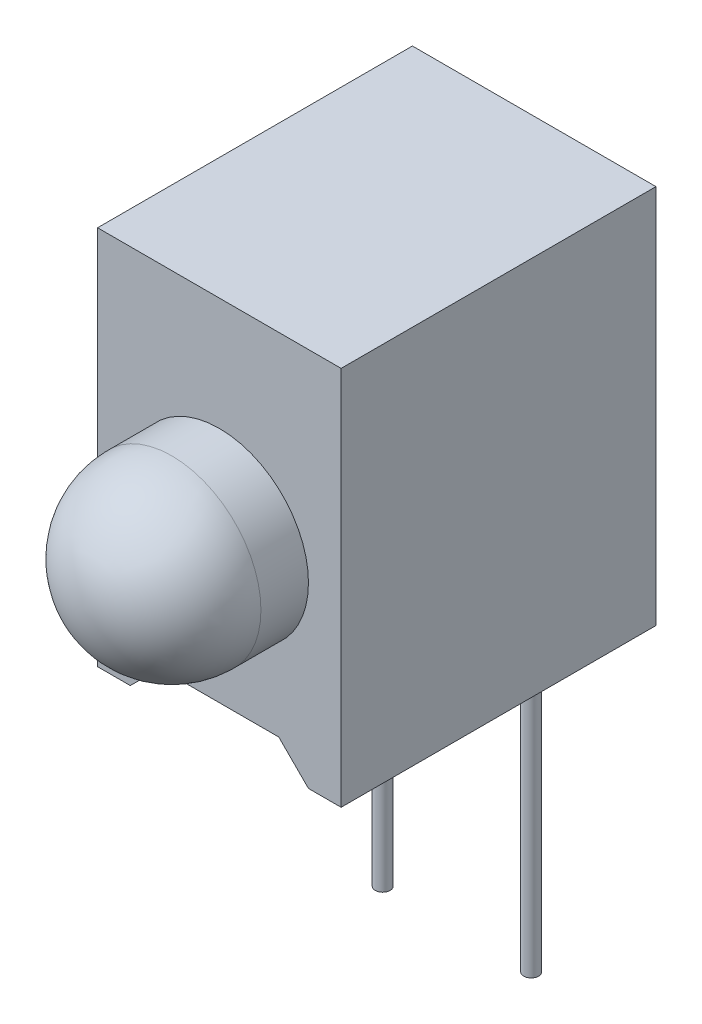
ISO-10303-21;
HEADER;
FILE_DESCRIPTION(('STEP AP214'),'2;1');
FILE_NAME('part.step','',(''),(''),'','','');
FILE_SCHEMA(('AUTOMOTIVE_DESIGN { 1 0 10303 214 1 1 1 1 }'));
ENDSEC;
DATA;
#1=APPLICATION_CONTEXT('core data for automotive mechanical design processes');
#2=APPLICATION_PROTOCOL_DEFINITION('international standard','automotive_design',2000,#1);
#3=PRODUCT_CONTEXT('',#1,'mechanical');
#4=PRODUCT('Part','Part','',(#3));
#5=PRODUCT_RELATED_PRODUCT_CATEGORY('part','',(#4));
#6=PRODUCT_DEFINITION_FORMATION('','',#4);
#7=PRODUCT_DEFINITION_CONTEXT('part definition',#1,'design');
#8=PRODUCT_DEFINITION('design','',#6,#7);
#9=PRODUCT_DEFINITION_SHAPE('','',#8);
#10=(LENGTH_UNIT() NAMED_UNIT(*) SI_UNIT(.MILLI.,.METRE.));
#11=(NAMED_UNIT(*) PLANE_ANGLE_UNIT() SI_UNIT($,.RADIAN.));
#12=(NAMED_UNIT(*) SI_UNIT($,.STERADIAN.) SOLID_ANGLE_UNIT());
#13=UNCERTAINTY_MEASURE_WITH_UNIT(LENGTH_MEASURE(1.E-05),#10,'distance_accuracy_value','');
#14=(GEOMETRIC_REPRESENTATION_CONTEXT(3) GLOBAL_UNCERTAINTY_ASSIGNED_CONTEXT((#13)) GLOBAL_UNIT_ASSIGNED_CONTEXT((#10,
#11,#12)) REPRESENTATION_CONTEXT('',''));
#15=CARTESIAN_POINT('',(0.,0.,0.));
#16=DIRECTION('',(0.,0.,1.));
#17=DIRECTION('',(1.,0.,0.));
#18=AXIS2_PLACEMENT_3D('',#15,#16,#17);
#19=CARTESIAN_POINT('',(-1.5,0.,-5.3));
#20=DIRECTION('',(0.707106781186544,-0.707106781186551,0.));
#21=DIRECTION('',(0.707106781186551,0.707106781186544,0.));
#22=AXIS2_PLACEMENT_3D('',#19,#20,#21);
#23=PLANE('',#22);
#24=DIRECTION('',(0.707106781186551,0.707106781186544,0.));
#25=VECTOR('',#24,1.);
#26=CARTESIAN_POINT('',(-1.5,0.,0.));
#27=LINE('',#26,#25);
#28=CARTESIAN_POINT('',(-1.5,0.,0.));
#29=VERTEX_POINT('',#28);
#30=CARTESIAN_POINT('',(-0.999999999999995,0.5,0.));
#31=VERTEX_POINT('',#30);
#32=EDGE_CURVE('E110',#29,#31,#27,.T.);
#33=ORIENTED_EDGE('',*,*,#32,.F.);
#34=DIRECTION('',(0.,0.,1.));
#35=VECTOR('',#34,1.);
#36=CARTESIAN_POINT('',(-1.5,0.,-5.3));
#37=LINE('',#36,#35);
#38=CARTESIAN_POINT('',(-1.5,0.,-5.3));
#39=VERTEX_POINT('',#38);
#40=EDGE_CURVE('E97',#39,#29,#37,.T.);
#41=ORIENTED_EDGE('',*,*,#40,.F.);
#42=DIRECTION('',(0.707106781186551,0.707106781186544,0.));
#43=VECTOR('',#42,1.);
#44=CARTESIAN_POINT('',(-1.5,0.,-5.3));
#45=LINE('',#44,#43);
#46=CARTESIAN_POINT('',(-0.999999999999995,0.5,-5.3));
#47=VERTEX_POINT('',#46);
#48=EDGE_CURVE('E142',#39,#47,#45,.T.);
#49=ORIENTED_EDGE('',*,*,#48,.T.);
#50=DIRECTION('',(0.,0.,1.));
#51=VECTOR('',#50,1.);
#52=CARTESIAN_POINT('',(-0.999999999999995,0.5,-5.3));
#53=LINE('',#52,#51);
#54=EDGE_CURVE('E106',#47,#31,#53,.T.);
#55=ORIENTED_EDGE('',*,*,#54,.T.);
#56=EDGE_LOOP('',(#33,#41,#49,#55));
#57=FACE_BOUND('',#56,.T.);
#58=CARTESIAN_POINT('',(-1.25,0.249999999999998,-4.));
#59=DIRECTION('',(0.707106781186544,-0.707106781186551,0.));
#60=DIRECTION('',(0.707106781186551,0.707106781186544,0.));
#61=AXIS2_PLACEMENT_3D('',#58,#59,#60);
#62=ELLIPSE('',#61,0.176776695296636,0.125);
#63=CARTESIAN_POINT('',(-1.125,0.374999999999996,-4.));
#64=VERTEX_POINT('',#63);
#65=EDGE_CURVE('E36',#64,#64,#62,.F.);
#66=ORIENTED_EDGE('',*,*,#65,.T.);
#67=EDGE_LOOP('',(#66));
#68=FACE_BOUND('',#67,.T.);
#69=ADVANCED_FACE('F32',(#57,#68),#23,.T.);
#70=CARTESIAN_POINT('',(0.999999999999995,0.5,-5.3));
#71=DIRECTION('',(-0.707106781186543,-0.707106781186551,0.));
#72=DIRECTION('',(0.707106781186552,-0.707106781186544,0.));
#73=AXIS2_PLACEMENT_3D('',#70,#71,#72);
#74=PLANE('',#73);
#75=DIRECTION('',(0.707106781186551,-0.707106781186543,0.));
#76=VECTOR('',#75,1.);
#77=CARTESIAN_POINT('',(0.999999999999995,0.5,0.));
#78=LINE('',#77,#76);
#79=CARTESIAN_POINT('',(0.999999999999995,0.5,0.));
#80=VERTEX_POINT('',#79);
#81=CARTESIAN_POINT('',(1.5,0.,0.));
#82=VERTEX_POINT('',#81);
#83=EDGE_CURVE('E129',#80,#82,#78,.T.);
#84=ORIENTED_EDGE('',*,*,#83,.F.);
#85=DIRECTION('',(0.,0.,1.));
#86=VECTOR('',#85,1.);
#87=CARTESIAN_POINT('',(0.999999999999995,0.5,-5.3));
#88=LINE('',#87,#86);
#89=CARTESIAN_POINT('',(0.999999999999995,0.5,-5.3));
#90=VERTEX_POINT('',#89);
#91=EDGE_CURVE('E167',#90,#80,#88,.T.);
#92=ORIENTED_EDGE('',*,*,#91,.F.);
#93=DIRECTION('',(0.707106781186551,-0.707106781186543,0.));
#94=VECTOR('',#93,1.);
#95=CARTESIAN_POINT('',(0.999999999999995,0.5,-5.3));
#96=LINE('',#95,#94);
#97=CARTESIAN_POINT('',(1.5,0.,-5.3));
#98=VERTEX_POINT('',#97);
#99=EDGE_CURVE('E147',#90,#98,#96,.T.);
#100=ORIENTED_EDGE('',*,*,#99,.T.);
#101=DIRECTION('',(0.,0.,1.));
#102=VECTOR('',#101,1.);
#103=CARTESIAN_POINT('',(1.5,0.,-5.3));
#104=LINE('',#103,#102);
#105=EDGE_CURVE('E165',#98,#82,#104,.T.);
#106=ORIENTED_EDGE('',*,*,#105,.T.);
#107=EDGE_LOOP('',(#84,#92,#100,#106));
#108=FACE_BOUND('',#107,.T.);
#109=CARTESIAN_POINT('',(1.25,0.249999999999997,-4.));
#110=DIRECTION('',(-0.707106781186543,-0.707106781186551,0.));
#111=DIRECTION('',(-0.707106781186552,0.707106781186544,0.));
#112=AXIS2_PLACEMENT_3D('',#109,#110,#111);
#113=ELLIPSE('',#112,0.176776695296636,0.125);
#114=CARTESIAN_POINT('',(1.125,0.374999999999995,-4.));
#115=VERTEX_POINT('',#114);
#116=EDGE_CURVE('E124',#115,#115,#113,.F.);
#117=ORIENTED_EDGE('',*,*,#116,.T.);
#118=EDGE_LOOP('',(#117));
#119=FACE_BOUND('',#118,.T.);
#120=ADVANCED_FACE('F198',(#108,#119),#74,.T.);
#121=CARTESIAN_POINT('',(-2.05,0.,0.));
#122=DIRECTION('',(0.,0.,1.));
#123=DIRECTION('',(1.,0.,0.));
#124=AXIS2_PLACEMENT_3D('',#121,#122,#123);
#125=PLANE('',#124);
#126=DIRECTION('',(1.,0.,0.));
#127=VECTOR('',#126,1.);
#128=CARTESIAN_POINT('',(-1.5,0.,0.));
#129=LINE('',#128,#127);
#130=CARTESIAN_POINT('',(-2.05,0.,0.));
#131=VERTEX_POINT('',#130);
#132=EDGE_CURVE('E100',#131,#29,#129,.T.);
#133=ORIENTED_EDGE('',*,*,#132,.T.);
#134=ORIENTED_EDGE('',*,*,#32,.T.);
#135=DIRECTION('',(1.,0.,0.));
#136=VECTOR('',#135,1.);
#137=CARTESIAN_POINT('',(-0.999999999999995,0.5,0.));
#138=LINE('',#137,#136);
#139=EDGE_CURVE('E115',#31,#80,#138,.T.);
#140=ORIENTED_EDGE('',*,*,#139,.T.);
#141=ORIENTED_EDGE('',*,*,#83,.T.);
#142=DIRECTION('',(1.,0.,0.));
#143=VECTOR('',#142,1.);
#144=CARTESIAN_POINT('',(2.05,0.,0.));
#145=LINE('',#144,#143);
#146=CARTESIAN_POINT('',(2.05,0.,0.));
#147=VERTEX_POINT('',#146);
#148=EDGE_CURVE('E132',#82,#147,#145,.T.);
#149=ORIENTED_EDGE('',*,*,#148,.T.);
#150=DIRECTION('',(0.,1.,0.));
#151=VECTOR('',#150,1.);
#152=CARTESIAN_POINT('',(2.05,6.4,0.));
#153=LINE('',#152,#151);
#154=CARTESIAN_POINT('',(2.05,6.4,0.));
#155=VERTEX_POINT('',#154);
#156=EDGE_CURVE('E135',#147,#155,#153,.T.);
#157=ORIENTED_EDGE('',*,*,#156,.T.);
#158=DIRECTION('',(-1.,0.,0.));
#159=VECTOR('',#158,1.);
#160=CARTESIAN_POINT('',(2.05,6.4,0.));
#161=LINE('',#160,#159);
#162=CARTESIAN_POINT('',(-2.05,6.39999999999999,0.));
#163=VERTEX_POINT('',#162);
#164=EDGE_CURVE('E138',#155,#163,#161,.T.);
#165=ORIENTED_EDGE('',*,*,#164,.T.);
#166=DIRECTION('',(0.,-1.,0.));
#167=VECTOR('',#166,1.);
#168=CARTESIAN_POINT('',(-2.05,6.39999999999999,0.));
#169=LINE('',#168,#167);
#170=EDGE_CURVE('E120',#163,#131,#169,.T.);
#171=ORIENTED_EDGE('',*,*,#170,.T.);
#172=EDGE_LOOP('',(#133,#134,#140,#141,#149,#157,#165,#171));
#173=FACE_BOUND('',#172,.T.);
#174=CARTESIAN_POINT('',(0.,3.,0.));
#175=DIRECTION('',(0.,0.,1.));
#176=DIRECTION('',(1.,0.,0.));
#177=AXIS2_PLACEMENT_3D('',#174,#175,#176);
#178=CIRCLE('',#177,1.5);
#179=CARTESIAN_POINT('',(1.5,3.,0.));
#180=VERTEX_POINT('',#179);
#181=EDGE_CURVE('E121',#180,#180,#178,.T.);
#182=ORIENTED_EDGE('',*,*,#181,.F.);
#183=EDGE_LOOP('',(#182));
#184=FACE_BOUND('',#183,.T.);
#185=ADVANCED_FACE('F117',(#173,#184),#125,.T.);
#186=CARTESIAN_POINT('',(-1.5,0.,-5.3));
#187=DIRECTION('',(0.,-1.,0.));
#188=DIRECTION('',(1.,0.,0.));
#189=AXIS2_PLACEMENT_3D('',#186,#187,#188);
#190=PLANE('',#189);
#191=ORIENTED_EDGE('',*,*,#132,.F.);
#192=DIRECTION('',(0.,0.,1.));
#193=VECTOR('',#192,1.);
#194=CARTESIAN_POINT('',(-2.05,0.,-5.3));
#195=LINE('',#194,#193);
#196=CARTESIAN_POINT('',(-2.05,0.,-5.3));
#197=VERTEX_POINT('',#196);
#198=EDGE_CURVE('E41',#197,#131,#195,.T.);
#199=ORIENTED_EDGE('',*,*,#198,.F.);
#200=DIRECTION('',(1.,0.,0.));
#201=VECTOR('',#200,1.);
#202=CARTESIAN_POINT('',(-1.5,0.,-5.3));
#203=LINE('',#202,#201);
#204=EDGE_CURVE('E102',#197,#39,#203,.T.);
#205=ORIENTED_EDGE('',*,*,#204,.T.);
#206=ORIENTED_EDGE('',*,*,#40,.T.);
#207=EDGE_LOOP('',(#191,#199,#205,#206));
#208=FACE_BOUND('',#207,.T.);
#209=ADVANCED_FACE('F34',(#208),#190,.T.);
#210=CARTESIAN_POINT('',(-2.05,6.39999999999999,-5.3));
#211=DIRECTION('',(-1.,0.,0.));
#212=DIRECTION('',(0.,-1.,0.));
#213=AXIS2_PLACEMENT_3D('',#210,#211,#212);
#214=PLANE('',#213);
#215=ORIENTED_EDGE('',*,*,#170,.F.);
#216=DIRECTION('',(0.,0.,1.));
#217=VECTOR('',#216,1.);
#218=CARTESIAN_POINT('',(-2.05,6.39999999999999,-5.3));
#219=LINE('',#218,#217);
#220=CARTESIAN_POINT('',(-2.05,6.39999999999999,-5.3));
#221=VERTEX_POINT('',#220);
#222=EDGE_CURVE('E56',#221,#163,#219,.T.);
#223=ORIENTED_EDGE('',*,*,#222,.F.);
#224=DIRECTION('',(0.,-1.,0.));
#225=VECTOR('',#224,1.);
#226=CARTESIAN_POINT('',(-2.05,6.39999999999999,-5.3));
#227=LINE('',#226,#225);
#228=EDGE_CURVE('E107',#221,#197,#227,.T.);
#229=ORIENTED_EDGE('',*,*,#228,.T.);
#230=ORIENTED_EDGE('',*,*,#198,.T.);
#231=EDGE_LOOP('',(#215,#223,#229,#230));
#232=FACE_BOUND('',#231,.T.);
#233=ADVANCED_FACE('F221',(#232),#214,.T.);
#234=CARTESIAN_POINT('',(2.05,6.4,-5.3));
#235=DIRECTION('',(0.,1.,0.));
#236=DIRECTION('',(-1.,0.,0.));
#237=AXIS2_PLACEMENT_3D('',#234,#235,#236);
#238=PLANE('',#237);
#239=ORIENTED_EDGE('',*,*,#164,.F.);
#240=DIRECTION('',(0.,0.,1.));
#241=VECTOR('',#240,1.);
#242=CARTESIAN_POINT('',(2.05,6.4,-5.3));
#243=LINE('',#242,#241);
#244=CARTESIAN_POINT('',(2.05,6.4,-5.3));
#245=VERTEX_POINT('',#244);
#246=EDGE_CURVE('E161',#245,#155,#243,.T.);
#247=ORIENTED_EDGE('',*,*,#246,.F.);
#248=DIRECTION('',(-1.,0.,0.));
#249=VECTOR('',#248,1.);
#250=CARTESIAN_POINT('',(2.05,6.4,-5.3));
#251=LINE('',#250,#249);
#252=EDGE_CURVE('E156',#245,#221,#251,.T.);
#253=ORIENTED_EDGE('',*,*,#252,.T.);
#254=ORIENTED_EDGE('',*,*,#222,.T.);
#255=EDGE_LOOP('',(#239,#247,#253,#254));
#256=FACE_BOUND('',#255,.T.);
#257=ADVANCED_FACE('F217',(#256),#238,.T.);
#258=CARTESIAN_POINT('',(2.05,6.4,-5.3));
#259=DIRECTION('',(1.,0.,0.));
#260=DIRECTION('',(0.,0.,-1.));
#261=AXIS2_PLACEMENT_3D('',#258,#259,#260);
#262=PLANE('',#261);
#263=ORIENTED_EDGE('',*,*,#156,.F.);
#264=DIRECTION('',(0.,0.,1.));
#265=VECTOR('',#264,1.);
#266=CARTESIAN_POINT('',(2.05,0.,-5.3));
#267=LINE('',#266,#265);
#268=CARTESIAN_POINT('',(2.05,0.,-5.3));
#269=VERTEX_POINT('',#268);
#270=EDGE_CURVE('E163',#269,#147,#267,.T.);
#271=ORIENTED_EDGE('',*,*,#270,.F.);
#272=DIRECTION('',(0.,1.,0.));
#273=VECTOR('',#272,1.);
#274=CARTESIAN_POINT('',(2.05,6.4,-5.3));
#275=LINE('',#274,#273);
#276=EDGE_CURVE('E153',#269,#245,#275,.T.);
#277=ORIENTED_EDGE('',*,*,#276,.T.);
#278=ORIENTED_EDGE('',*,*,#246,.T.);
#279=EDGE_LOOP('',(#263,#271,#277,#278));
#280=FACE_BOUND('',#279,.T.);
#281=ADVANCED_FACE('F213',(#280),#262,.T.);
#282=CARTESIAN_POINT('',(2.05,0.,-5.3));
#283=DIRECTION('',(0.,-1.,0.));
#284=DIRECTION('',(1.,0.,0.));
#285=AXIS2_PLACEMENT_3D('',#282,#283,#284);
#286=PLANE('',#285);
#287=ORIENTED_EDGE('',*,*,#148,.F.);
#288=ORIENTED_EDGE('',*,*,#105,.F.);
#289=DIRECTION('',(1.,0.,0.));
#290=VECTOR('',#289,1.);
#291=CARTESIAN_POINT('',(2.05,0.,-5.3));
#292=LINE('',#291,#290);
#293=EDGE_CURVE('E150',#98,#269,#292,.T.);
#294=ORIENTED_EDGE('',*,*,#293,.T.);
#295=ORIENTED_EDGE('',*,*,#270,.T.);
#296=EDGE_LOOP('',(#287,#288,#294,#295));
#297=FACE_BOUND('',#296,.T.);
#298=ADVANCED_FACE('F208',(#297),#286,.T.);
#299=CARTESIAN_POINT('',(-0.999999999999995,0.5,-5.3));
#300=DIRECTION('',(0.,-1.,0.));
#301=DIRECTION('',(0.,0.,-1.));
#302=AXIS2_PLACEMENT_3D('',#299,#300,#301);
#303=PLANE('',#302);
#304=ORIENTED_EDGE('',*,*,#139,.F.);
#305=ORIENTED_EDGE('',*,*,#54,.F.);
#306=DIRECTION('',(1.,0.,0.));
#307=VECTOR('',#306,1.);
#308=CARTESIAN_POINT('',(-0.999999999999995,0.5,-5.3));
#309=LINE('',#308,#307);
#310=EDGE_CURVE('E144',#47,#90,#309,.T.);
#311=ORIENTED_EDGE('',*,*,#310,.T.);
#312=ORIENTED_EDGE('',*,*,#91,.T.);
#313=EDGE_LOOP('',(#304,#305,#311,#312));
#314=FACE_BOUND('',#313,.T.);
#315=ADVANCED_FACE('F205',(#314),#303,.T.);
#316=CARTESIAN_POINT('',(-2.05,0.,-5.3));
#317=DIRECTION('',(0.,0.,1.));
#318=DIRECTION('',(1.,0.,0.));
#319=AXIS2_PLACEMENT_3D('',#316,#317,#318);
#320=PLANE('',#319);
#321=ORIENTED_EDGE('',*,*,#204,.F.);
#322=ORIENTED_EDGE('',*,*,#228,.F.);
#323=ORIENTED_EDGE('',*,*,#252,.F.);
#324=ORIENTED_EDGE('',*,*,#276,.F.);
#325=ORIENTED_EDGE('',*,*,#293,.F.);
#326=ORIENTED_EDGE('',*,*,#99,.F.);
#327=ORIENTED_EDGE('',*,*,#310,.F.);
#328=ORIENTED_EDGE('',*,*,#48,.F.);
#329=EDGE_LOOP('',(#321,#322,#323,#324,#325,#326,#327,#328));
#330=FACE_BOUND('',#329,.T.);
#331=ADVANCED_FACE('F207',(#330),#320,.F.);
#332=CARTESIAN_POINT('',(0.,3.,2.3));
#333=DIRECTION('',(0.,0.,-1.));
#334=DIRECTION('',(-1.,0.,0.));
#335=AXIS2_PLACEMENT_3D('',#332,#333,#334);
#336=CYLINDRICAL_SURFACE('',#335,1.5);
#337=CARTESIAN_POINT('',(0.,3.,0.8));
#338=DIRECTION('',(0.,0.,-1.));
#339=DIRECTION('',(-1.,0.,0.));
#340=AXIS2_PLACEMENT_3D('',#337,#338,#339);
#341=CIRCLE('',#340,1.5);
#342=CARTESIAN_POINT('',(-1.5,3.,0.8));
#343=VERTEX_POINT('',#342);
#344=EDGE_CURVE('E11',#343,#343,#341,.T.);
#345=ORIENTED_EDGE('',*,*,#344,.T.);
#346=EDGE_LOOP('',(#345));
#347=FACE_BOUND('',#346,.T.);
#348=ORIENTED_EDGE('',*,*,#181,.T.);
#349=EDGE_LOOP('',(#348));
#350=FACE_BOUND('',#349,.T.);
#351=ADVANCED_FACE('F227',(#347,#350),#336,.T.);
#352=CARTESIAN_POINT('',(0.,3.,0.8));
#353=DIRECTION('',(0.,0.,1.));
#354=DIRECTION('',(1.,0.,0.));
#355=AXIS2_PLACEMENT_3D('',#352,#353,#354);
#356=SPHERICAL_SURFACE('',#355,1.5);
#357=ORIENTED_EDGE('',*,*,#344,.F.);
#358=EDGE_LOOP('',(#357));
#359=FACE_BOUND('',#358,.T.);
#360=ADVANCED_FACE('F233',(#359),#356,.T.);
#361=CARTESIAN_POINT('',(1.25,-4.8,-4.));
#362=DIRECTION('',(0.,1.,0.));
#363=DIRECTION('',(0.,0.,1.));
#364=AXIS2_PLACEMENT_3D('',#361,#362,#363);
#365=CYLINDRICAL_SURFACE('',#364,0.125);
#366=ORIENTED_EDGE('',*,*,#116,.F.);
#367=EDGE_LOOP('',(#366));
#368=FACE_BOUND('',#367,.T.);
#369=CARTESIAN_POINT('',(1.25,-4.8,-4.));
#370=DIRECTION('',(0.,-1.,0.));
#371=DIRECTION('',(0.,0.,-1.));
#372=AXIS2_PLACEMENT_3D('',#369,#370,#371);
#373=CIRCLE('',#372,0.125);
#374=CARTESIAN_POINT('',(1.25,-4.8,-4.125));
#375=VERTEX_POINT('',#374);
#376=EDGE_CURVE('E170',#375,#375,#373,.T.);
#377=ORIENTED_EDGE('',*,*,#376,.F.);
#378=EDGE_LOOP('',(#377));
#379=FACE_BOUND('',#378,.T.);
#380=ADVANCED_FACE('F194',(#368,#379),#365,.T.);
#381=CARTESIAN_POINT('',(1.25,-4.8,-4.));
#382=DIRECTION('',(0.,-1.,0.));
#383=DIRECTION('',(0.,0.,-1.));
#384=AXIS2_PLACEMENT_3D('',#381,#382,#383);
#385=PLANE('',#384);
#386=ORIENTED_EDGE('',*,*,#376,.T.);
#387=EDGE_LOOP('',(#386));
#388=FACE_BOUND('',#387,.T.);
#389=ADVANCED_FACE('F186',(#388),#385,.T.);
#390=CARTESIAN_POINT('',(-1.25,-4.8,-4.));
#391=DIRECTION('',(0.,1.,0.));
#392=DIRECTION('',(0.,0.,1.));
#393=AXIS2_PLACEMENT_3D('',#390,#391,#392);
#394=CYLINDRICAL_SURFACE('',#393,0.125);
#395=ORIENTED_EDGE('',*,*,#65,.F.);
#396=EDGE_LOOP('',(#395));
#397=FACE_BOUND('',#396,.T.);
#398=CARTESIAN_POINT('',(-1.25,-4.8,-4.));
#399=DIRECTION('',(0.,-1.,0.));
#400=DIRECTION('',(0.,0.,1.));
#401=AXIS2_PLACEMENT_3D('',#398,#399,#400);
#402=CIRCLE('',#401,0.125);
#403=CARTESIAN_POINT('',(-1.25,-4.8,-3.875));
#404=VERTEX_POINT('',#403);
#405=EDGE_CURVE('E177',#404,#404,#402,.T.);
#406=ORIENTED_EDGE('',*,*,#405,.F.);
#407=EDGE_LOOP('',(#406));
#408=FACE_BOUND('',#407,.T.);
#409=ADVANCED_FACE('F184',(#397,#408),#394,.T.);
#410=CARTESIAN_POINT('',(-1.25,-4.8,-4.));
#411=DIRECTION('',(0.,1.,0.));
#412=DIRECTION('',(0.,0.,1.));
#413=AXIS2_PLACEMENT_3D('',#410,#411,#412);
#414=PLANE('',#413);
#415=ORIENTED_EDGE('',*,*,#405,.T.);
#416=EDGE_LOOP('',(#415));
#417=FACE_BOUND('',#416,.T.);
#418=ADVANCED_FACE('F182',(#417),#414,.F.);
#419=CLOSED_SHELL('',(#69,#120,#185,#209,#233,#257,#281,#298,#315,#331,#351,#360,#380,#389,#409,#418));
#420=MANIFOLD_SOLID_BREP('B2',#419);
#421=ADVANCED_BREP_SHAPE_REPRESENTATION('',(#18,#420),#14);
#422=SHAPE_DEFINITION_REPRESENTATION(#9,#421);
ENDSEC;
END-ISO-10303-21;
